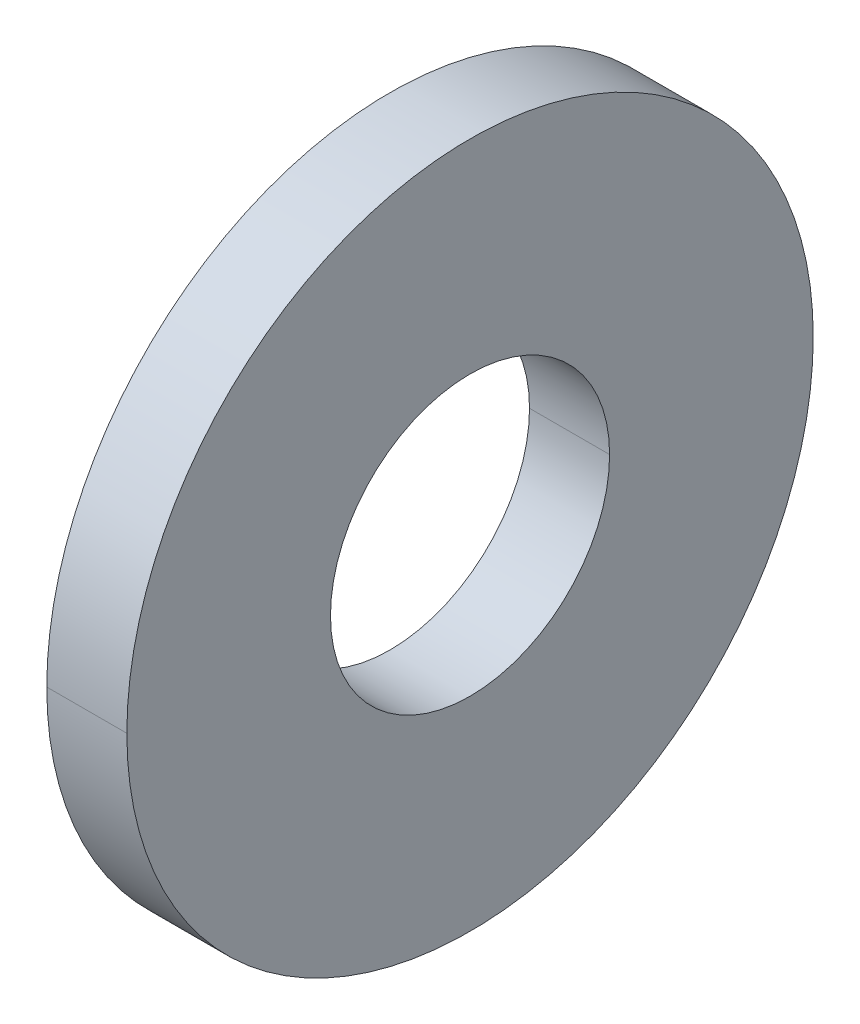
ISO-10303-21;
HEADER;
FILE_DESCRIPTION(('STEP AP214'),'2;1');
FILE_NAME('part.step','',(''),(''),'','','');
FILE_SCHEMA(('AUTOMOTIVE_DESIGN { 1 0 10303 214 1 1 1 1 }'));
ENDSEC;
DATA;
#1=APPLICATION_CONTEXT('core data for automotive mechanical design processes');
#2=APPLICATION_PROTOCOL_DEFINITION('international standard','automotive_design',2000,#1);
#3=PRODUCT_CONTEXT('',#1,'mechanical');
#4=PRODUCT('Part','Part','',(#3));
#5=PRODUCT_RELATED_PRODUCT_CATEGORY('part','',(#4));
#6=PRODUCT_DEFINITION_FORMATION('','',#4);
#7=PRODUCT_DEFINITION_CONTEXT('part definition',#1,'design');
#8=PRODUCT_DEFINITION('design','',#6,#7);
#9=PRODUCT_DEFINITION_SHAPE('','',#8);
#10=(LENGTH_UNIT() NAMED_UNIT(*) SI_UNIT(.MILLI.,.METRE.));
#11=(NAMED_UNIT(*) PLANE_ANGLE_UNIT() SI_UNIT($,.RADIAN.));
#12=(NAMED_UNIT(*) SI_UNIT($,.STERADIAN.) SOLID_ANGLE_UNIT());
#13=UNCERTAINTY_MEASURE_WITH_UNIT(LENGTH_MEASURE(1.E-05),#10,'distance_accuracy_value','');
#14=(GEOMETRIC_REPRESENTATION_CONTEXT(3) GLOBAL_UNCERTAINTY_ASSIGNED_CONTEXT((#13)) GLOBAL_UNIT_ASSIGNED_CONTEXT((#10,
#11,#12)) REPRESENTATION_CONTEXT('',''));
#15=CARTESIAN_POINT('',(0.,0.,0.));
#16=DIRECTION('',(0.,0.,1.));
#17=DIRECTION('',(1.,0.,0.));
#18=AXIS2_PLACEMENT_3D('',#15,#16,#17);
#19=CARTESIAN_POINT('',(-34.925,0.,0.));
#20=DIRECTION('',(-1.,0.,0.));
#21=DIRECTION('',(0.,0.,1.));
#22=AXIS2_PLACEMENT_3D('',#19,#20,#21);
#23=CYLINDRICAL_SURFACE('',#22,6.);
#24=CARTESIAN_POINT('',(0.,0.,0.));
#25=DIRECTION('',(-1.,0.,0.));
#26=DIRECTION('',(0.,0.,1.));
#27=AXIS2_PLACEMENT_3D('',#24,#25,#26);
#28=CIRCLE('',#27,6.);
#29=CARTESIAN_POINT('',(0.,0.,6.));
#30=VERTEX_POINT('',#29);
#31=CARTESIAN_POINT('',(0.,0.,-6.));
#32=VERTEX_POINT('',#31);
#33=EDGE_CURVE('E11',#30,#32,#28,.T.);
#34=ORIENTED_EDGE('',*,*,#33,.T.);
#35=DIRECTION('',(-1.,0.,0.));
#36=VECTOR('',#35,1.);
#37=CARTESIAN_POINT('',(-34.925,0.,-6.));
#38=LINE('',#37,#36);
#39=CARTESIAN_POINT('',(-1.39999999999998,0.,-6.));
#40=VERTEX_POINT('',#39);
#41=EDGE_CURVE('E28',#32,#40,#38,.T.);
#42=ORIENTED_EDGE('',*,*,#41,.T.);
#43=CARTESIAN_POINT('',(-1.39999999999998,0.,0.));
#44=DIRECTION('',(-1.,0.,0.));
#45=DIRECTION('',(0.,0.,1.));
#46=AXIS2_PLACEMENT_3D('',#43,#44,#45);
#47=CIRCLE('',#46,6.);
#48=CARTESIAN_POINT('',(-1.39999999999998,0.,6.));
#49=VERTEX_POINT('',#48);
#50=EDGE_CURVE('E93',#49,#40,#47,.T.);
#51=ORIENTED_EDGE('',*,*,#50,.F.);
#52=DIRECTION('',(-1.,0.,0.));
#53=VECTOR('',#52,1.);
#54=CARTESIAN_POINT('',(-34.925,0.,6.));
#55=LINE('',#54,#53);
#56=EDGE_CURVE('E95',#30,#49,#55,.T.);
#57=ORIENTED_EDGE('',*,*,#56,.F.);
#58=EDGE_LOOP('',(#34,#42,#51,#57));
#59=FACE_BOUND('',#58,.T.);
#60=ADVANCED_FACE('F17',(#59),#23,.T.);
#61=CARTESIAN_POINT('',(-34.925,0.,0.));
#62=DIRECTION('',(-1.,0.,0.));
#63=DIRECTION('',(0.,0.,1.));
#64=AXIS2_PLACEMENT_3D('',#61,#62,#63);
#65=CYLINDRICAL_SURFACE('',#64,2.44);
#66=CARTESIAN_POINT('',(0.,0.,0.));
#67=DIRECTION('',(-1.,0.,0.));
#68=DIRECTION('',(0.,0.,1.));
#69=AXIS2_PLACEMENT_3D('',#66,#67,#68);
#70=CIRCLE('',#69,2.44);
#71=CARTESIAN_POINT('',(0.,0.,-2.44));
#72=VERTEX_POINT('',#71);
#73=CARTESIAN_POINT('',(0.,0.,2.44));
#74=VERTEX_POINT('',#73);
#75=EDGE_CURVE('E58',#72,#74,#70,.T.);
#76=ORIENTED_EDGE('',*,*,#75,.F.);
#77=DIRECTION('',(-1.,0.,0.));
#78=VECTOR('',#77,1.);
#79=CARTESIAN_POINT('',(-34.925,0.,-2.44));
#80=LINE('',#79,#78);
#81=CARTESIAN_POINT('',(-1.39999999999998,0.,-2.44));
#82=VERTEX_POINT('',#81);
#83=EDGE_CURVE('E21',#72,#82,#80,.T.);
#84=ORIENTED_EDGE('',*,*,#83,.T.);
#85=CARTESIAN_POINT('',(-1.39999999999998,0.,0.));
#86=DIRECTION('',(-1.,0.,0.));
#87=DIRECTION('',(0.,0.,1.));
#88=AXIS2_PLACEMENT_3D('',#85,#86,#87);
#89=CIRCLE('',#88,2.44);
#90=CARTESIAN_POINT('',(-1.39999999999998,0.,2.44));
#91=VERTEX_POINT('',#90);
#92=EDGE_CURVE('E76',#82,#91,#89,.T.);
#93=ORIENTED_EDGE('',*,*,#92,.T.);
#94=DIRECTION('',(-1.,0.,0.));
#95=VECTOR('',#94,1.);
#96=CARTESIAN_POINT('',(-34.925,0.,2.43999999999997));
#97=LINE('',#96,#95);
#98=EDGE_CURVE('E67',#74,#91,#97,.T.);
#99=ORIENTED_EDGE('',*,*,#98,.F.);
#100=EDGE_LOOP('',(#76,#84,#93,#99));
#101=FACE_BOUND('',#100,.T.);
#102=ADVANCED_FACE('F19',(#101),#65,.F.);
#103=CARTESIAN_POINT('',(-34.925,0.,0.));
#104=DIRECTION('',(-1.,0.,0.));
#105=DIRECTION('',(0.,0.,1.));
#106=AXIS2_PLACEMENT_3D('',#103,#104,#105);
#107=CYLINDRICAL_SURFACE('',#106,2.44);
#108=ORIENTED_EDGE('',*,*,#83,.F.);
#109=CARTESIAN_POINT('',(0.,0.,0.));
#110=DIRECTION('',(-1.,0.,0.));
#111=DIRECTION('',(0.,0.,1.));
#112=AXIS2_PLACEMENT_3D('',#109,#110,#111);
#113=CIRCLE('',#112,2.44);
#114=EDGE_CURVE('E116',#74,#72,#113,.T.);
#115=ORIENTED_EDGE('',*,*,#114,.F.);
#116=ORIENTED_EDGE('',*,*,#98,.T.);
#117=CARTESIAN_POINT('',(-1.39999999999998,0.,0.));
#118=DIRECTION('',(-1.,0.,0.));
#119=DIRECTION('',(0.,0.,1.));
#120=AXIS2_PLACEMENT_3D('',#117,#118,#119);
#121=CIRCLE('',#120,2.44);
#122=EDGE_CURVE('E122',#91,#82,#121,.T.);
#123=ORIENTED_EDGE('',*,*,#122,.T.);
#124=EDGE_LOOP('',(#108,#115,#116,#123));
#125=FACE_BOUND('',#124,.T.);
#126=ADVANCED_FACE('F179',(#125),#107,.F.);
#127=CARTESIAN_POINT('',(0.,2.44,0.));
#128=DIRECTION('',(-1.,0.,0.));
#129=DIRECTION('',(0.,0.,1.));
#130=AXIS2_PLACEMENT_3D('',#127,#128,#129);
#131=PLANE('',#130);
#132=ORIENTED_EDGE('',*,*,#33,.F.);
#133=CARTESIAN_POINT('',(0.,0.,0.));
#134=DIRECTION('',(-1.,0.,0.));
#135=DIRECTION('',(0.,0.,1.));
#136=AXIS2_PLACEMENT_3D('',#133,#134,#135);
#137=CIRCLE('',#136,6.);
#138=EDGE_CURVE('E104',#32,#30,#137,.T.);
#139=ORIENTED_EDGE('',*,*,#138,.F.);
#140=EDGE_LOOP('',(#132,#139));
#141=FACE_BOUND('',#140,.T.);
#142=ORIENTED_EDGE('',*,*,#114,.T.);
#143=ORIENTED_EDGE('',*,*,#75,.T.);
#144=EDGE_LOOP('',(#142,#143));
#145=FACE_BOUND('',#144,.T.);
#146=ADVANCED_FACE('F167',(#141,#145),#131,.F.);
#147=CARTESIAN_POINT('',(-34.925,0.,0.));
#148=DIRECTION('',(-1.,0.,0.));
#149=DIRECTION('',(0.,0.,1.));
#150=AXIS2_PLACEMENT_3D('',#147,#148,#149);
#151=CYLINDRICAL_SURFACE('',#150,6.);
#152=ORIENTED_EDGE('',*,*,#41,.F.);
#153=ORIENTED_EDGE('',*,*,#138,.T.);
#154=ORIENTED_EDGE('',*,*,#56,.T.);
#155=CARTESIAN_POINT('',(-1.39999999999998,0.,0.));
#156=DIRECTION('',(-1.,0.,0.));
#157=DIRECTION('',(0.,0.,1.));
#158=AXIS2_PLACEMENT_3D('',#155,#156,#157);
#159=CIRCLE('',#158,6.);
#160=EDGE_CURVE('E100',#40,#49,#159,.T.);
#161=ORIENTED_EDGE('',*,*,#160,.F.);
#162=EDGE_LOOP('',(#152,#153,#154,#161));
#163=FACE_BOUND('',#162,.T.);
#164=ADVANCED_FACE('F102',(#163),#151,.T.);
#165=CARTESIAN_POINT('',(-1.39999999999998,6.,0.));
#166=DIRECTION('',(1.,0.,0.));
#167=DIRECTION('',(0.,-1.,0.));
#168=AXIS2_PLACEMENT_3D('',#165,#166,#167);
#169=PLANE('',#168);
#170=ORIENTED_EDGE('',*,*,#50,.T.);
#171=ORIENTED_EDGE('',*,*,#160,.T.);
#172=EDGE_LOOP('',(#170,#171));
#173=FACE_BOUND('',#172,.T.);
#174=ORIENTED_EDGE('',*,*,#122,.F.);
#175=ORIENTED_EDGE('',*,*,#92,.F.);
#176=EDGE_LOOP('',(#174,#175));
#177=FACE_BOUND('',#176,.T.);
#178=ADVANCED_FACE('F107',(#173,#177),#169,.F.);
#179=CLOSED_SHELL('',(#60,#102,#126,#146,#164,#178));
#180=MANIFOLD_SOLID_BREP('B1',#179);
#181=ADVANCED_BREP_SHAPE_REPRESENTATION('',(#18,#180),#14);
#182=SHAPE_DEFINITION_REPRESENTATION(#9,#181);
ENDSEC;
END-ISO-10303-21;
